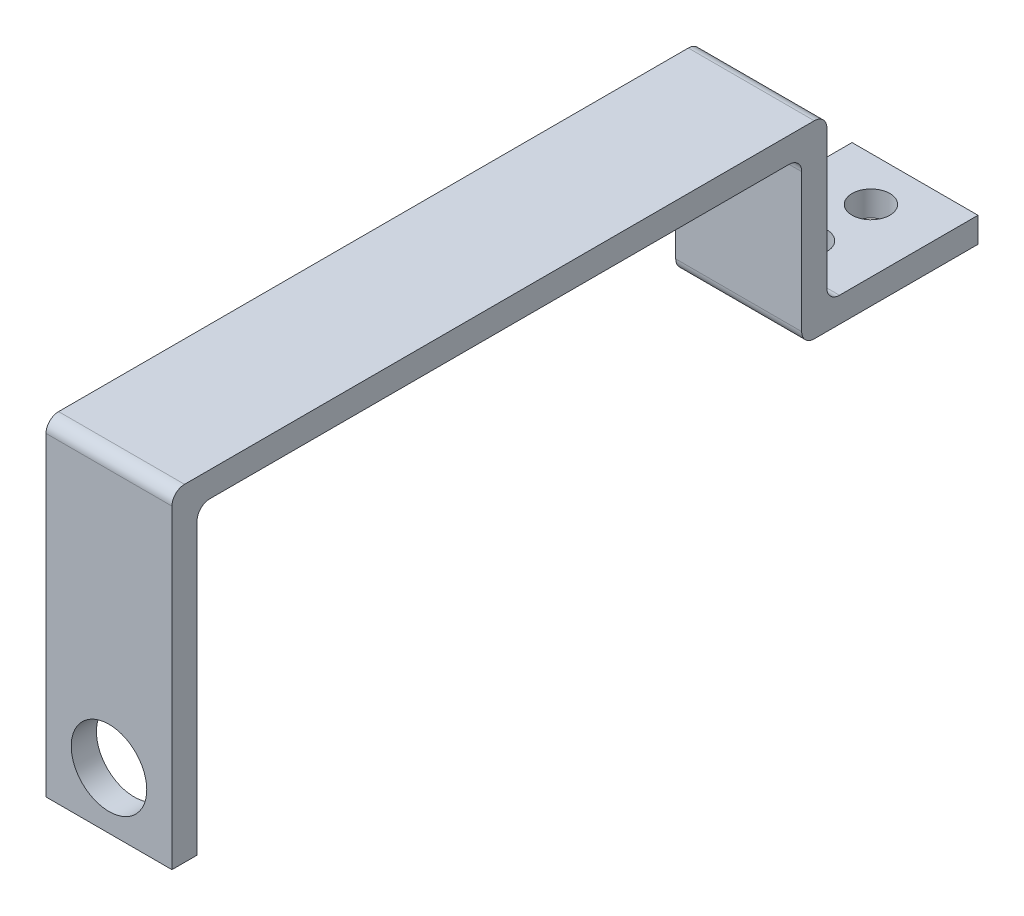
ISO-10303-21;
HEADER;
FILE_DESCRIPTION(('STEP AP214'),'2;1');
FILE_NAME('part.step','',(''),(''),'','','');
FILE_SCHEMA(('AUTOMOTIVE_DESIGN { 1 0 10303 214 1 1 1 1 }'));
ENDSEC;
DATA;
#1=APPLICATION_CONTEXT('core data for automotive mechanical design processes');
#2=APPLICATION_PROTOCOL_DEFINITION('international standard','automotive_design',2000,#1);
#3=PRODUCT_CONTEXT('',#1,'mechanical');
#4=PRODUCT('Part','Part','',(#3));
#5=PRODUCT_RELATED_PRODUCT_CATEGORY('part','',(#4));
#6=PRODUCT_DEFINITION_FORMATION('','',#4);
#7=PRODUCT_DEFINITION_CONTEXT('part definition',#1,'design');
#8=PRODUCT_DEFINITION('design','',#6,#7);
#9=PRODUCT_DEFINITION_SHAPE('','',#8);
#10=(LENGTH_UNIT() NAMED_UNIT(*) SI_UNIT(.MILLI.,.METRE.));
#11=(NAMED_UNIT(*) PLANE_ANGLE_UNIT() SI_UNIT($,.RADIAN.));
#12=(NAMED_UNIT(*) SI_UNIT($,.STERADIAN.) SOLID_ANGLE_UNIT());
#13=UNCERTAINTY_MEASURE_WITH_UNIT(LENGTH_MEASURE(1.E-05),#10,'distance_accuracy_value','');
#14=(GEOMETRIC_REPRESENTATION_CONTEXT(3) GLOBAL_UNCERTAINTY_ASSIGNED_CONTEXT((#13)) GLOBAL_UNIT_ASSIGNED_CONTEXT((#10,
#11,#12)) REPRESENTATION_CONTEXT('',''));
#15=CARTESIAN_POINT('',(0.,0.,0.));
#16=DIRECTION('',(0.,0.,1.));
#17=DIRECTION('',(1.,0.,0.));
#18=AXIS2_PLACEMENT_3D('',#15,#16,#17);
#19=CARTESIAN_POINT('',(0.,2.,0.));
#20=DIRECTION('',(0.,1.,0.));
#21=DIRECTION('',(0.,0.,1.));
#22=AXIS2_PLACEMENT_3D('',#19,#20,#21);
#23=PLANE('',#22);
#24=CARTESIAN_POINT('',(-0.0869565217391276,2.,1.45652173913043));
#25=DIRECTION('',(0.,1.,0.));
#26=DIRECTION('',(0.,0.,1.));
#27=AXIS2_PLACEMENT_3D('',#24,#25,#26);
#28=CIRCLE('',#27,1.5);
#29=CARTESIAN_POINT('',(-0.0869565217391276,2.,2.95652173913043));
#30=VERTEX_POINT('',#29);
#31=EDGE_CURVE('E290',#30,#30,#28,.T.);
#32=ORIENTED_EDGE('',*,*,#31,.F.);
#33=EDGE_LOOP('',(#32));
#34=FACE_BOUND('',#33,.T.);
#35=DIRECTION('',(0.,0.,1.));
#36=VECTOR('',#35,1.);
#37=CARTESIAN_POINT('',(-5.08695652173913,2.,-7.04347826086957));
#38=LINE('',#37,#36);
#39=CARTESIAN_POINT('',(-5.08695652173913,2.,-7.04347826086957));
#40=VERTEX_POINT('',#39);
#41=CARTESIAN_POINT('',(-5.08695652173913,2.,3.95652173913043));
#42=VERTEX_POINT('',#41);
#43=EDGE_CURVE('E261',#40,#42,#38,.T.);
#44=ORIENTED_EDGE('',*,*,#43,.T.);
#45=DIRECTION('',(1.,0.,0.));
#46=VECTOR('',#45,1.);
#47=CARTESIAN_POINT('',(4.91304347826087,2.,3.95652173913043));
#48=LINE('',#47,#46);
#49=CARTESIAN_POINT('',(4.91304347826087,2.,3.95652173913043));
#50=VERTEX_POINT('',#49);
#51=EDGE_CURVE('E256',#42,#50,#48,.T.);
#52=ORIENTED_EDGE('',*,*,#51,.T.);
#53=DIRECTION('',(0.,0.,-1.));
#54=VECTOR('',#53,1.);
#55=CARTESIAN_POINT('',(4.91304347826087,2.,-7.04347826086957));
#56=LINE('',#55,#54);
#57=CARTESIAN_POINT('',(4.91304347826087,2.,-7.04347826086957));
#58=VERTEX_POINT('',#57);
#59=EDGE_CURVE('E257',#50,#58,#56,.T.);
#60=ORIENTED_EDGE('',*,*,#59,.T.);
#61=DIRECTION('',(-1.,0.,0.));
#62=VECTOR('',#61,1.);
#63=CARTESIAN_POINT('',(-5.08695652173913,2.,-7.04347826086957));
#64=LINE('',#63,#62);
#65=EDGE_CURVE('E260',#58,#40,#64,.T.);
#66=ORIENTED_EDGE('',*,*,#65,.T.);
#67=EDGE_LOOP('',(#44,#52,#60,#66));
#68=FACE_BOUND('',#67,.T.);
#69=CARTESIAN_POINT('',(-0.0869565217391276,2.,-3.54347826086957));
#70=DIRECTION('',(0.,1.,0.));
#71=DIRECTION('',(0.,0.,1.));
#72=AXIS2_PLACEMENT_3D('',#69,#70,#71);
#73=CIRCLE('',#72,1.5);
#74=CARTESIAN_POINT('',(-0.0869565217391276,2.,-2.04347826086957));
#75=VERTEX_POINT('',#74);
#76=EDGE_CURVE('E296',#75,#75,#73,.T.);
#77=ORIENTED_EDGE('',*,*,#76,.F.);
#78=EDGE_LOOP('',(#77));
#79=FACE_BOUND('',#78,.T.);
#80=ADVANCED_FACE('F33',(#34,#68,#79),#23,.T.);
#81=CARTESIAN_POINT('',(0.,0.,0.));
#82=DIRECTION('',(0.,1.,0.));
#83=DIRECTION('',(0.,0.,1.));
#84=AXIS2_PLACEMENT_3D('',#81,#82,#83);
#85=PLANE('',#84);
#86=CARTESIAN_POINT('',(-0.0869565217391276,0.,1.45652173913043));
#87=DIRECTION('',(0.,1.,0.));
#88=DIRECTION('',(0.,0.,1.));
#89=AXIS2_PLACEMENT_3D('',#86,#87,#88);
#90=CIRCLE('',#89,1.5);
#91=CARTESIAN_POINT('',(-0.0869565217391276,0.,2.95652173913043));
#92=VERTEX_POINT('',#91);
#93=EDGE_CURVE('E288',#92,#92,#90,.T.);
#94=ORIENTED_EDGE('',*,*,#93,.T.);
#95=EDGE_LOOP('',(#94));
#96=FACE_BOUND('',#95,.T.);
#97=DIRECTION('',(0.,0.,-1.));
#98=VECTOR('',#97,1.);
#99=CARTESIAN_POINT('',(4.91304347826087,0.,-7.04347826086957));
#100=LINE('',#99,#98);
#101=CARTESIAN_POINT('',(4.91304347826087,0.,5.95652173913043));
#102=VERTEX_POINT('',#101);
#103=CARTESIAN_POINT('',(4.91304347826087,0.,-7.04347826086957));
#104=VERTEX_POINT('',#103);
#105=EDGE_CURVE('E273',#102,#104,#100,.T.);
#106=ORIENTED_EDGE('',*,*,#105,.F.);
#107=DIRECTION('',(1.,0.,0.));
#108=VECTOR('',#107,1.);
#109=CARTESIAN_POINT('',(0.,0.,5.95652173913043));
#110=LINE('',#109,#108);
#111=CARTESIAN_POINT('',(-5.08695652173913,0.,5.95652173913043));
#112=VERTEX_POINT('',#111);
#113=EDGE_CURVE('E252',#102,#112,#110,.F.);
#114=ORIENTED_EDGE('',*,*,#113,.T.);
#115=DIRECTION('',(0.,0.,1.));
#116=VECTOR('',#115,1.);
#117=CARTESIAN_POINT('',(-5.08695652173913,0.,-7.04347826086957));
#118=LINE('',#117,#116);
#119=CARTESIAN_POINT('',(-5.08695652173913,0.,-7.04347826086957));
#120=VERTEX_POINT('',#119);
#121=EDGE_CURVE('E280',#120,#112,#118,.T.);
#122=ORIENTED_EDGE('',*,*,#121,.F.);
#123=DIRECTION('',(-1.,0.,0.));
#124=VECTOR('',#123,1.);
#125=CARTESIAN_POINT('',(-5.08695652173913,0.,-7.04347826086957));
#126=LINE('',#125,#124);
#127=EDGE_CURVE('E268',#104,#120,#126,.T.);
#128=ORIENTED_EDGE('',*,*,#127,.F.);
#129=EDGE_LOOP('',(#106,#114,#122,#128));
#130=FACE_BOUND('',#129,.T.);
#131=CARTESIAN_POINT('',(-0.0869565217391276,0.,-3.54347826086957));
#132=DIRECTION('',(0.,1.,0.));
#133=DIRECTION('',(0.,0.,1.));
#134=AXIS2_PLACEMENT_3D('',#131,#132,#133);
#135=CIRCLE('',#134,1.5);
#136=CARTESIAN_POINT('',(-0.0869565217391276,0.,-2.04347826086957));
#137=VERTEX_POINT('',#136);
#138=EDGE_CURVE('E244',#137,#137,#135,.T.);
#139=ORIENTED_EDGE('',*,*,#138,.T.);
#140=EDGE_LOOP('',(#139));
#141=FACE_BOUND('',#140,.T.);
#142=ADVANCED_FACE('F306',(#96,#130,#141),#85,.F.);
#143=CARTESIAN_POINT('',(-5.08695652173913,2.,-7.04347826086957));
#144=DIRECTION('',(1.,0.,0.));
#145=DIRECTION('',(0.,0.,-1.));
#146=AXIS2_PLACEMENT_3D('',#143,#144,#145);
#147=PLANE('',#146);
#148=ORIENTED_EDGE('',*,*,#121,.T.);
#149=CARTESIAN_POINT('',(-5.08695652173913,1.,5.95652173913043));
#150=DIRECTION('',(1.,0.,0.));
#151=DIRECTION('',(0.,0.,-1.));
#152=AXIS2_PLACEMENT_3D('',#149,#150,#151);
#153=CIRCLE('',#152,1.);
#154=CARTESIAN_POINT('',(-5.08695652173913,1.,6.95652173913043));
#155=VERTEX_POINT('',#154);
#156=EDGE_CURVE('E254',#112,#155,#153,.F.);
#157=ORIENTED_EDGE('',*,*,#156,.T.);
#158=DIRECTION('',(0.,-1.,0.));
#159=VECTOR('',#158,1.);
#160=CARTESIAN_POINT('',(-5.08695652173913,0.,6.95652173913043));
#161=LINE('',#160,#159);
#162=CARTESIAN_POINT('',(-5.08695652173913,12.,6.95652173913043));
#163=VERTEX_POINT('',#162);
#164=EDGE_CURVE('E228',#163,#155,#161,.T.);
#165=ORIENTED_EDGE('',*,*,#164,.F.);
#166=CARTESIAN_POINT('',(-5.08695652173913,12.,7.95652173913043));
#167=DIRECTION('',(1.,0.,0.));
#168=DIRECTION('',(0.,0.,-1.));
#169=AXIS2_PLACEMENT_3D('',#166,#167,#168);
#170=CIRCLE('',#169,1.);
#171=CARTESIAN_POINT('',(-5.08695652173913,13.,7.95652173913043));
#172=VERTEX_POINT('',#171);
#173=EDGE_CURVE('E360',#163,#172,#170,.T.);
#174=ORIENTED_EDGE('',*,*,#173,.T.);
#175=DIRECTION('',(0.,0.,1.));
#176=VECTOR('',#175,1.);
#177=CARTESIAN_POINT('',(-5.08695652173913,13.,4.95652173913043));
#178=LINE('',#177,#176);
#179=CARTESIAN_POINT('',(-5.08695652173912,13.,53.9565217391304));
#180=VERTEX_POINT('',#179);
#181=EDGE_CURVE('E173',#172,#180,#178,.T.);
#182=ORIENTED_EDGE('',*,*,#181,.T.);
#183=CARTESIAN_POINT('',(-5.08695652173912,12.,53.9565217391304));
#184=DIRECTION('',(1.,0.,0.));
#185=DIRECTION('',(0.,0.,-1.));
#186=AXIS2_PLACEMENT_3D('',#183,#184,#185);
#187=CIRCLE('',#186,1.);
#188=CARTESIAN_POINT('',(-5.08695652173912,12.,54.9565217391304));
#189=VERTEX_POINT('',#188);
#190=EDGE_CURVE('E372',#180,#189,#187,.T.);
#191=ORIENTED_EDGE('',*,*,#190,.T.);
#192=DIRECTION('',(0.,-1.,0.));
#193=VECTOR('',#192,1.);
#194=CARTESIAN_POINT('',(-5.08695652173912,15.,54.9565217391304));
#195=LINE('',#194,#193);
#196=CARTESIAN_POINT('',(-5.08695652173912,-11.,54.9565217391304));
#197=VERTEX_POINT('',#196);
#198=EDGE_CURVE('E171',#189,#197,#195,.T.);
#199=ORIENTED_EDGE('',*,*,#198,.T.);
#200=DIRECTION('',(0.,0.,-1.));
#201=VECTOR('',#200,1.);
#202=CARTESIAN_POINT('',(-5.08695652173912,-11.,56.9565217391304));
#203=LINE('',#202,#201);
#204=CARTESIAN_POINT('',(-5.08695652173912,-11.,56.9565217391304));
#205=VERTEX_POINT('',#204);
#206=EDGE_CURVE('E162',#205,#197,#203,.T.);
#207=ORIENTED_EDGE('',*,*,#206,.F.);
#208=DIRECTION('',(0.,-1.,0.));
#209=VECTOR('',#208,1.);
#210=CARTESIAN_POINT('',(-5.08695652173912,15.,56.9565217391304));
#211=LINE('',#210,#209);
#212=CARTESIAN_POINT('',(-5.08695652173912,14.,56.9565217391304));
#213=VERTEX_POINT('',#212);
#214=EDGE_CURVE('E145',#213,#205,#211,.T.);
#215=ORIENTED_EDGE('',*,*,#214,.F.);
#216=CARTESIAN_POINT('',(-5.08695652173912,14.,55.9565217391304));
#217=DIRECTION('',(1.,0.,0.));
#218=DIRECTION('',(0.,0.,-1.));
#219=AXIS2_PLACEMENT_3D('',#216,#217,#218);
#220=CIRCLE('',#219,1.);
#221=CARTESIAN_POINT('',(-5.08695652173912,15.,55.9565217391304));
#222=VERTEX_POINT('',#221);
#223=EDGE_CURVE('E381',#213,#222,#220,.F.);
#224=ORIENTED_EDGE('',*,*,#223,.T.);
#225=DIRECTION('',(0.,0.,1.));
#226=VECTOR('',#225,1.);
#227=CARTESIAN_POINT('',(-5.08695652173913,15.,4.95652173913043));
#228=LINE('',#227,#226);
#229=CARTESIAN_POINT('',(-5.08695652173913,15.,5.95652173913043));
#230=VERTEX_POINT('',#229);
#231=EDGE_CURVE('E183',#230,#222,#228,.T.);
#232=ORIENTED_EDGE('',*,*,#231,.F.);
#233=CARTESIAN_POINT('',(-5.08695652173913,14.,5.95652173913043));
#234=DIRECTION('',(1.,0.,0.));
#235=DIRECTION('',(0.,0.,-1.));
#236=AXIS2_PLACEMENT_3D('',#233,#234,#235);
#237=CIRCLE('',#236,1.);
#238=CARTESIAN_POINT('',(-5.08695652173913,14.,4.95652173913043));
#239=VERTEX_POINT('',#238);
#240=EDGE_CURVE('E220',#230,#239,#237,.F.);
#241=ORIENTED_EDGE('',*,*,#240,.T.);
#242=DIRECTION('',(0.,-1.,0.));
#243=VECTOR('',#242,1.);
#244=CARTESIAN_POINT('',(-5.08695652173913,0.,4.95652173913043));
#245=LINE('',#244,#243);
#246=CARTESIAN_POINT('',(-5.08695652173913,3.,4.95652173913043));
#247=VERTEX_POINT('',#246);
#248=EDGE_CURVE('E213',#239,#247,#245,.T.);
#249=ORIENTED_EDGE('',*,*,#248,.T.);
#250=CARTESIAN_POINT('',(-5.08695652173913,3.,3.95652173913043));
#251=DIRECTION('',(1.,0.,0.));
#252=DIRECTION('',(0.,0.,-1.));
#253=AXIS2_PLACEMENT_3D('',#250,#251,#252);
#254=CIRCLE('',#253,1.);
#255=EDGE_CURVE('E11',#247,#42,#254,.T.);
#256=ORIENTED_EDGE('',*,*,#255,.T.);
#257=ORIENTED_EDGE('',*,*,#43,.F.);
#258=DIRECTION('',(0.,-1.,0.));
#259=VECTOR('',#258,1.);
#260=CARTESIAN_POINT('',(-5.08695652173913,2.,-7.04347826086957));
#261=LINE('',#260,#259);
#262=EDGE_CURVE('E283',#40,#120,#261,.T.);
#263=ORIENTED_EDGE('',*,*,#262,.T.);
#264=EDGE_LOOP('',(#148,#157,#165,#174,#182,#191,#199,#207,#215,#224,#232,#241,#249,#256,#257,#263));
#265=FACE_BOUND('',#264,.T.);
#266=ADVANCED_FACE('F169',(#265),#147,.F.);
#267=CARTESIAN_POINT('',(4.91304347826087,2.,-7.04347826086957));
#268=DIRECTION('',(-1.,0.,0.));
#269=DIRECTION('',(0.,0.,1.));
#270=AXIS2_PLACEMENT_3D('',#267,#268,#269);
#271=PLANE('',#270);
#272=DIRECTION('',(0.,1.,0.));
#273=VECTOR('',#272,1.);
#274=CARTESIAN_POINT('',(4.91304347826087,0.,6.95652173913043));
#275=LINE('',#274,#273);
#276=CARTESIAN_POINT('',(4.91304347826087,1.,6.95652173913043));
#277=VERTEX_POINT('',#276);
#278=CARTESIAN_POINT('',(4.91304347826087,12.,6.95652173913043));
#279=VERTEX_POINT('',#278);
#280=EDGE_CURVE('E232',#277,#279,#275,.T.);
#281=ORIENTED_EDGE('',*,*,#280,.F.);
#282=CARTESIAN_POINT('',(4.91304347826087,1.,5.95652173913043));
#283=DIRECTION('',(-1.,0.,0.));
#284=DIRECTION('',(0.,0.,1.));
#285=AXIS2_PLACEMENT_3D('',#282,#283,#284);
#286=CIRCLE('',#285,1.);
#287=EDGE_CURVE('E250',#277,#102,#286,.F.);
#288=ORIENTED_EDGE('',*,*,#287,.T.);
#289=ORIENTED_EDGE('',*,*,#105,.T.);
#290=DIRECTION('',(0.,-1.,0.));
#291=VECTOR('',#290,1.);
#292=CARTESIAN_POINT('',(4.91304347826087,2.,-7.04347826086957));
#293=LINE('',#292,#291);
#294=EDGE_CURVE('E265',#58,#104,#293,.T.);
#295=ORIENTED_EDGE('',*,*,#294,.F.);
#296=ORIENTED_EDGE('',*,*,#59,.F.);
#297=CARTESIAN_POINT('',(4.91304347826087,3.,3.95652173913043));
#298=DIRECTION('',(-1.,0.,0.));
#299=DIRECTION('',(0.,0.,1.));
#300=AXIS2_PLACEMENT_3D('',#297,#298,#299);
#301=CIRCLE('',#300,1.);
#302=CARTESIAN_POINT('',(4.91304347826087,3.,4.95652173913043));
#303=VERTEX_POINT('',#302);
#304=EDGE_CURVE('E41',#50,#303,#301,.T.);
#305=ORIENTED_EDGE('',*,*,#304,.T.);
#306=DIRECTION('',(0.,1.,0.));
#307=VECTOR('',#306,1.);
#308=CARTESIAN_POINT('',(4.91304347826087,0.,4.95652173913043));
#309=LINE('',#308,#307);
#310=CARTESIAN_POINT('',(4.91304347826087,14.,4.95652173913043));
#311=VERTEX_POINT('',#310);
#312=EDGE_CURVE('E216',#303,#311,#309,.T.);
#313=ORIENTED_EDGE('',*,*,#312,.T.);
#314=CARTESIAN_POINT('',(4.91304347826087,14.,5.95652173913043));
#315=DIRECTION('',(-1.,0.,0.));
#316=DIRECTION('',(0.,0.,1.));
#317=AXIS2_PLACEMENT_3D('',#314,#315,#316);
#318=CIRCLE('',#317,1.);
#319=CARTESIAN_POINT('',(4.91304347826087,15.,5.95652173913043));
#320=VERTEX_POINT('',#319);
#321=EDGE_CURVE('E225',#311,#320,#318,.F.);
#322=ORIENTED_EDGE('',*,*,#321,.T.);
#323=DIRECTION('',(0.,0.,-1.));
#324=VECTOR('',#323,1.);
#325=CARTESIAN_POINT('',(4.91304347826087,15.,4.95652173913043));
#326=LINE('',#325,#324);
#327=CARTESIAN_POINT('',(4.91304347826088,15.,55.9565217391304));
#328=VERTEX_POINT('',#327);
#329=EDGE_CURVE('E217',#328,#320,#326,.T.);
#330=ORIENTED_EDGE('',*,*,#329,.F.);
#331=CARTESIAN_POINT('',(4.91304347826088,14.,55.9565217391304));
#332=DIRECTION('',(-1.,0.,0.));
#333=DIRECTION('',(0.,0.,1.));
#334=AXIS2_PLACEMENT_3D('',#331,#332,#333);
#335=CIRCLE('',#334,1.);
#336=CARTESIAN_POINT('',(4.91304347826088,14.,56.9565217391304));
#337=VERTEX_POINT('',#336);
#338=EDGE_CURVE('E194',#328,#337,#335,.F.);
#339=ORIENTED_EDGE('',*,*,#338,.T.);
#340=DIRECTION('',(0.,1.,0.));
#341=VECTOR('',#340,1.);
#342=CARTESIAN_POINT('',(4.91304347826088,15.,56.9565217391304));
#343=LINE('',#342,#341);
#344=CARTESIAN_POINT('',(4.91304347826088,-11.,56.9565217391304));
#345=VERTEX_POINT('',#344);
#346=EDGE_CURVE('E166',#345,#337,#343,.T.);
#347=ORIENTED_EDGE('',*,*,#346,.F.);
#348=DIRECTION('',(0.,0.,-1.));
#349=VECTOR('',#348,1.);
#350=CARTESIAN_POINT('',(4.91304347826088,-11.,56.9565217391304));
#351=LINE('',#350,#349);
#352=CARTESIAN_POINT('',(4.91304347826088,-11.,54.9565217391304));
#353=VERTEX_POINT('',#352);
#354=EDGE_CURVE('E164',#345,#353,#351,.T.);
#355=ORIENTED_EDGE('',*,*,#354,.T.);
#356=DIRECTION('',(0.,1.,0.));
#357=VECTOR('',#356,1.);
#358=CARTESIAN_POINT('',(4.91304347826088,15.,54.9565217391304));
#359=LINE('',#358,#357);
#360=CARTESIAN_POINT('',(4.91304347826088,12.,54.9565217391304));
#361=VERTEX_POINT('',#360);
#362=EDGE_CURVE('E157',#353,#361,#359,.T.);
#363=ORIENTED_EDGE('',*,*,#362,.T.);
#364=CARTESIAN_POINT('',(4.91304347826088,12.,53.9565217391304));
#365=DIRECTION('',(-1.,0.,0.));
#366=DIRECTION('',(0.,0.,1.));
#367=AXIS2_PLACEMENT_3D('',#364,#365,#366);
#368=CIRCLE('',#367,1.);
#369=CARTESIAN_POINT('',(4.91304347826088,13.,53.9565217391304));
#370=VERTEX_POINT('',#369);
#371=EDGE_CURVE('E366',#361,#370,#368,.T.);
#372=ORIENTED_EDGE('',*,*,#371,.T.);
#373=DIRECTION('',(0.,0.,-1.));
#374=VECTOR('',#373,1.);
#375=CARTESIAN_POINT('',(4.91304347826087,13.,4.95652173913043));
#376=LINE('',#375,#374);
#377=CARTESIAN_POINT('',(4.91304347826087,13.,7.95652173913043));
#378=VERTEX_POINT('',#377);
#379=EDGE_CURVE('E175',#370,#378,#376,.T.);
#380=ORIENTED_EDGE('',*,*,#379,.T.);
#381=CARTESIAN_POINT('',(4.91304347826087,12.,7.95652173913043));
#382=DIRECTION('',(-1.,0.,0.));
#383=DIRECTION('',(0.,0.,1.));
#384=AXIS2_PLACEMENT_3D('',#381,#382,#383);
#385=CIRCLE('',#384,1.);
#386=EDGE_CURVE('E245',#378,#279,#385,.T.);
#387=ORIENTED_EDGE('',*,*,#386,.T.);
#388=EDGE_LOOP('',(#281,#288,#289,#295,#296,#305,#313,#322,#330,#339,#347,#355,#363,#372,#380,#387));
#389=FACE_BOUND('',#388,.T.);
#390=ADVANCED_FACE('F321',(#389),#271,.F.);
#391=CARTESIAN_POINT('',(-5.08695652173913,2.,-7.04347826086957));
#392=DIRECTION('',(0.,0.,1.));
#393=DIRECTION('',(1.,0.,0.));
#394=AXIS2_PLACEMENT_3D('',#391,#392,#393);
#395=PLANE('',#394);
#396=ORIENTED_EDGE('',*,*,#127,.T.);
#397=ORIENTED_EDGE('',*,*,#262,.F.);
#398=ORIENTED_EDGE('',*,*,#65,.F.);
#399=ORIENTED_EDGE('',*,*,#294,.T.);
#400=EDGE_LOOP('',(#396,#397,#398,#399));
#401=FACE_BOUND('',#400,.T.);
#402=ADVANCED_FACE('F318',(#401),#395,.F.);
#403=CARTESIAN_POINT('',(-0.0869565217391276,2.,1.45652173913043));
#404=DIRECTION('',(0.,-1.,0.));
#405=DIRECTION('',(0.,0.,-1.));
#406=AXIS2_PLACEMENT_3D('',#403,#404,#405);
#407=CYLINDRICAL_SURFACE('',#406,1.5);
#408=ORIENTED_EDGE('',*,*,#31,.T.);
#409=EDGE_LOOP('',(#408));
#410=FACE_BOUND('',#409,.T.);
#411=ORIENTED_EDGE('',*,*,#93,.F.);
#412=EDGE_LOOP('',(#411));
#413=FACE_BOUND('',#412,.T.);
#414=ADVANCED_FACE('F315',(#410,#413),#407,.F.);
#415=CARTESIAN_POINT('',(-0.0869565217391276,2.,-3.54347826086957));
#416=DIRECTION('',(0.,-1.,0.));
#417=DIRECTION('',(0.,0.,-1.));
#418=AXIS2_PLACEMENT_3D('',#415,#416,#417);
#419=CYLINDRICAL_SURFACE('',#418,1.5);
#420=ORIENTED_EDGE('',*,*,#76,.T.);
#421=EDGE_LOOP('',(#420));
#422=FACE_BOUND('',#421,.T.);
#423=ORIENTED_EDGE('',*,*,#138,.F.);
#424=EDGE_LOOP('',(#423));
#425=FACE_BOUND('',#424,.T.);
#426=ADVANCED_FACE('F302',(#422,#425),#419,.F.);
#427=CARTESIAN_POINT('',(0.,0.,4.95652173913043));
#428=DIRECTION('',(0.,0.,-1.));
#429=DIRECTION('',(-1.,0.,0.));
#430=AXIS2_PLACEMENT_3D('',#427,#428,#429);
#431=PLANE('',#430);
#432=ORIENTED_EDGE('',*,*,#312,.F.);
#433=DIRECTION('',(1.,0.,0.));
#434=VECTOR('',#433,1.);
#435=CARTESIAN_POINT('',(-5.08695652173913,3.,4.95652173913043));
#436=LINE('',#435,#434);
#437=EDGE_CURVE('E54',#303,#247,#436,.F.);
#438=ORIENTED_EDGE('',*,*,#437,.T.);
#439=ORIENTED_EDGE('',*,*,#248,.F.);
#440=DIRECTION('',(-1.,0.,0.));
#441=VECTOR('',#440,1.);
#442=CARTESIAN_POINT('',(0.,14.,4.95652173913043));
#443=LINE('',#442,#441);
#444=EDGE_CURVE('E222',#239,#311,#443,.F.);
#445=ORIENTED_EDGE('',*,*,#444,.T.);
#446=EDGE_LOOP('',(#432,#438,#439,#445));
#447=FACE_BOUND('',#446,.T.);
#448=ADVANCED_FACE('F386',(#447),#431,.T.);
#449=CARTESIAN_POINT('',(0.,0.,6.95652173913043));
#450=DIRECTION('',(0.,0.,-1.));
#451=DIRECTION('',(-1.,0.,0.));
#452=AXIS2_PLACEMENT_3D('',#449,#450,#451);
#453=PLANE('',#452);
#454=ORIENTED_EDGE('',*,*,#164,.T.);
#455=DIRECTION('',(1.,0.,0.));
#456=VECTOR('',#455,1.);
#457=CARTESIAN_POINT('',(0.,1.,6.95652173913043));
#458=LINE('',#457,#456);
#459=EDGE_CURVE('E247',#155,#277,#458,.T.);
#460=ORIENTED_EDGE('',*,*,#459,.T.);
#461=ORIENTED_EDGE('',*,*,#280,.T.);
#462=DIRECTION('',(-1.,0.,0.));
#463=VECTOR('',#462,1.);
#464=CARTESIAN_POINT('',(-5.08695652173913,12.,6.95652173913043));
#465=LINE('',#464,#463);
#466=EDGE_CURVE('E227',#279,#163,#465,.T.);
#467=ORIENTED_EDGE('',*,*,#466,.T.);
#468=EDGE_LOOP('',(#454,#460,#461,#467));
#469=FACE_BOUND('',#468,.T.);
#470=ADVANCED_FACE('F354',(#469),#453,.F.);
#471=CARTESIAN_POINT('',(0.,15.,0.));
#472=DIRECTION('',(0.,1.,0.));
#473=DIRECTION('',(0.,0.,1.));
#474=AXIS2_PLACEMENT_3D('',#471,#472,#473);
#475=PLANE('',#474);
#476=ORIENTED_EDGE('',*,*,#329,.T.);
#477=DIRECTION('',(-1.,0.,0.));
#478=VECTOR('',#477,1.);
#479=CARTESIAN_POINT('',(0.,15.,5.95652173913043));
#480=LINE('',#479,#478);
#481=EDGE_CURVE('E218',#320,#230,#480,.T.);
#482=ORIENTED_EDGE('',*,*,#481,.T.);
#483=ORIENTED_EDGE('',*,*,#231,.T.);
#484=DIRECTION('',(-1.,0.,0.));
#485=VECTOR('',#484,1.);
#486=CARTESIAN_POINT('',(0.,15.,55.9565217391304));
#487=LINE('',#486,#485);
#488=EDGE_CURVE('E383',#222,#328,#487,.F.);
#489=ORIENTED_EDGE('',*,*,#488,.T.);
#490=EDGE_LOOP('',(#476,#482,#483,#489));
#491=FACE_BOUND('',#490,.T.);
#492=ADVANCED_FACE('F378',(#491),#475,.T.);
#493=CARTESIAN_POINT('',(0.,13.,0.));
#494=DIRECTION('',(0.,1.,0.));
#495=DIRECTION('',(0.,0.,1.));
#496=AXIS2_PLACEMENT_3D('',#493,#494,#495);
#497=PLANE('',#496);
#498=ORIENTED_EDGE('',*,*,#181,.F.);
#499=DIRECTION('',(-1.,0.,0.));
#500=VECTOR('',#499,1.);
#501=CARTESIAN_POINT('',(4.91304347826087,13.,7.95652173913043));
#502=LINE('',#501,#500);
#503=EDGE_CURVE('E359',#172,#378,#502,.F.);
#504=ORIENTED_EDGE('',*,*,#503,.T.);
#505=ORIENTED_EDGE('',*,*,#379,.F.);
#506=DIRECTION('',(1.,0.,0.));
#507=VECTOR('',#506,1.);
#508=CARTESIAN_POINT('',(-5.08695652173912,13.,53.9565217391304));
#509=LINE('',#508,#507);
#510=EDGE_CURVE('E199',#370,#180,#509,.F.);
#511=ORIENTED_EDGE('',*,*,#510,.T.);
#512=EDGE_LOOP('',(#498,#504,#505,#511));
#513=FACE_BOUND('',#512,.T.);
#514=ADVANCED_FACE('F369',(#513),#497,.F.);
#515=CARTESIAN_POINT('',(0.,0.,54.9565217391304));
#516=DIRECTION('',(0.,0.,1.));
#517=DIRECTION('',(1.,0.,0.));
#518=AXIS2_PLACEMENT_3D('',#515,#516,#517);
#519=PLANE('',#518);
#520=CARTESIAN_POINT('',(-0.0869565217391215,-6.5,54.9565217391304));
#521=DIRECTION('',(0.,0.,1.));
#522=DIRECTION('',(1.,0.,0.));
#523=AXIS2_PLACEMENT_3D('',#520,#521,#522);
#524=CIRCLE('',#523,3.);
#525=CARTESIAN_POINT('',(2.91304347826088,-6.5,54.9565217391304));
#526=VERTEX_POINT('',#525);
#527=EDGE_CURVE('E424',#526,#526,#524,.T.);
#528=ORIENTED_EDGE('',*,*,#527,.T.);
#529=EDGE_LOOP('',(#528));
#530=FACE_BOUND('',#529,.T.);
#531=ORIENTED_EDGE('',*,*,#198,.F.);
#532=DIRECTION('',(1.,0.,0.));
#533=VECTOR('',#532,1.);
#534=CARTESIAN_POINT('',(4.91304347826088,12.,54.9565217391304));
#535=LINE('',#534,#533);
#536=EDGE_CURVE('E196',#189,#361,#535,.T.);
#537=ORIENTED_EDGE('',*,*,#536,.T.);
#538=ORIENTED_EDGE('',*,*,#362,.F.);
#539=DIRECTION('',(1.,0.,0.));
#540=VECTOR('',#539,1.);
#541=CARTESIAN_POINT('',(-5.08695652173912,-11.,54.9565217391304));
#542=LINE('',#541,#540);
#543=EDGE_CURVE('E182',#197,#353,#542,.T.);
#544=ORIENTED_EDGE('',*,*,#543,.F.);
#545=EDGE_LOOP('',(#531,#537,#538,#544));
#546=FACE_BOUND('',#545,.T.);
#547=ADVANCED_FACE('F405',(#530,#546),#519,.F.);
#548=CARTESIAN_POINT('',(0.,0.,56.9565217391304));
#549=DIRECTION('',(0.,0.,1.));
#550=DIRECTION('',(1.,0.,0.));
#551=AXIS2_PLACEMENT_3D('',#548,#549,#550);
#552=PLANE('',#551);
#553=ORIENTED_EDGE('',*,*,#346,.T.);
#554=DIRECTION('',(-1.,0.,0.));
#555=VECTOR('',#554,1.);
#556=CARTESIAN_POINT('',(0.,14.,56.9565217391304));
#557=LINE('',#556,#555);
#558=EDGE_CURVE('E153',#337,#213,#557,.T.);
#559=ORIENTED_EDGE('',*,*,#558,.T.);
#560=ORIENTED_EDGE('',*,*,#214,.T.);
#561=DIRECTION('',(1.,0.,0.));
#562=VECTOR('',#561,1.);
#563=CARTESIAN_POINT('',(-5.08695652173912,-11.,56.9565217391304));
#564=LINE('',#563,#562);
#565=EDGE_CURVE('E150',#205,#345,#564,.T.);
#566=ORIENTED_EDGE('',*,*,#565,.T.);
#567=EDGE_LOOP('',(#553,#559,#560,#566));
#568=FACE_BOUND('',#567,.T.);
#569=CARTESIAN_POINT('',(-0.0869565217391215,-6.5,56.9565217391304));
#570=DIRECTION('',(0.,0.,1.));
#571=DIRECTION('',(1.,0.,0.));
#572=AXIS2_PLACEMENT_3D('',#569,#570,#571);
#573=CIRCLE('',#572,3.);
#574=CARTESIAN_POINT('',(2.91304347826088,-6.5,56.9565217391304));
#575=VERTEX_POINT('',#574);
#576=EDGE_CURVE('E193',#575,#575,#573,.T.);
#577=ORIENTED_EDGE('',*,*,#576,.F.);
#578=EDGE_LOOP('',(#577));
#579=FACE_BOUND('',#578,.T.);
#580=ADVANCED_FACE('F148',(#568,#579),#552,.T.);
#581=CARTESIAN_POINT('',(-5.08695652173912,-11.,56.9565217391304));
#582=DIRECTION('',(0.,1.,0.));
#583=DIRECTION('',(0.,0.,1.));
#584=AXIS2_PLACEMENT_3D('',#581,#582,#583);
#585=PLANE('',#584);
#586=ORIENTED_EDGE('',*,*,#543,.T.);
#587=ORIENTED_EDGE('',*,*,#354,.F.);
#588=ORIENTED_EDGE('',*,*,#565,.F.);
#589=ORIENTED_EDGE('',*,*,#206,.T.);
#590=EDGE_LOOP('',(#586,#587,#588,#589));
#591=FACE_BOUND('',#590,.T.);
#592=ADVANCED_FACE('F161',(#591),#585,.F.);
#593=CARTESIAN_POINT('',(-0.0869565217391215,-6.5,56.9565217391304));
#594=DIRECTION('',(0.,0.,-1.));
#595=DIRECTION('',(-1.,0.,0.));
#596=AXIS2_PLACEMENT_3D('',#593,#594,#595);
#597=CYLINDRICAL_SURFACE('',#596,3.);
#598=ORIENTED_EDGE('',*,*,#576,.T.);
#599=EDGE_LOOP('',(#598));
#600=FACE_BOUND('',#599,.T.);
#601=ORIENTED_EDGE('',*,*,#527,.F.);
#602=EDGE_LOOP('',(#601));
#603=FACE_BOUND('',#602,.T.);
#604=ADVANCED_FACE('F330',(#600,#603),#597,.F.);
#605=CARTESIAN_POINT('',(0.,14.,55.9565217391304));
#606=DIRECTION('',(-1.,0.,0.));
#607=DIRECTION('',(0.,0.,1.));
#608=AXIS2_PLACEMENT_3D('',#605,#606,#607);
#609=CYLINDRICAL_SURFACE('',#608,1.);
#610=ORIENTED_EDGE('',*,*,#338,.F.);
#611=ORIENTED_EDGE('',*,*,#488,.F.);
#612=ORIENTED_EDGE('',*,*,#223,.F.);
#613=ORIENTED_EDGE('',*,*,#558,.F.);
#614=EDGE_LOOP('',(#610,#611,#612,#613));
#615=FACE_BOUND('',#614,.T.);
#616=ADVANCED_FACE('F326',(#615),#609,.T.);
#617=CARTESIAN_POINT('',(0.,12.,53.9565217391304));
#618=DIRECTION('',(-1.,0.,0.));
#619=DIRECTION('',(0.,0.,1.));
#620=AXIS2_PLACEMENT_3D('',#617,#618,#619);
#621=CYLINDRICAL_SURFACE('',#620,1.);
#622=ORIENTED_EDGE('',*,*,#190,.F.);
#623=ORIENTED_EDGE('',*,*,#510,.F.);
#624=ORIENTED_EDGE('',*,*,#371,.F.);
#625=ORIENTED_EDGE('',*,*,#536,.F.);
#626=EDGE_LOOP('',(#622,#623,#624,#625));
#627=FACE_BOUND('',#626,.T.);
#628=ADVANCED_FACE('F329',(#627),#621,.F.);
#629=CARTESIAN_POINT('',(0.,14.,5.95652173913043));
#630=DIRECTION('',(-1.,0.,0.));
#631=DIRECTION('',(0.,0.,1.));
#632=AXIS2_PLACEMENT_3D('',#629,#630,#631);
#633=CYLINDRICAL_SURFACE('',#632,1.);
#634=ORIENTED_EDGE('',*,*,#321,.F.);
#635=ORIENTED_EDGE('',*,*,#444,.F.);
#636=ORIENTED_EDGE('',*,*,#240,.F.);
#637=ORIENTED_EDGE('',*,*,#481,.F.);
#638=EDGE_LOOP('',(#634,#635,#636,#637));
#639=FACE_BOUND('',#638,.T.);
#640=ADVANCED_FACE('F334',(#639),#633,.T.);
#641=CARTESIAN_POINT('',(0.,12.,7.95652173913043));
#642=DIRECTION('',(1.,0.,0.));
#643=DIRECTION('',(0.,0.,-1.));
#644=AXIS2_PLACEMENT_3D('',#641,#642,#643);
#645=CYLINDRICAL_SURFACE('',#644,1.);
#646=ORIENTED_EDGE('',*,*,#386,.F.);
#647=ORIENTED_EDGE('',*,*,#503,.F.);
#648=ORIENTED_EDGE('',*,*,#173,.F.);
#649=ORIENTED_EDGE('',*,*,#466,.F.);
#650=EDGE_LOOP('',(#646,#647,#648,#649));
#651=FACE_BOUND('',#650,.T.);
#652=ADVANCED_FACE('F338',(#651),#645,.F.);
#653=CARTESIAN_POINT('',(0.,1.,5.95652173913043));
#654=DIRECTION('',(1.,0.,0.));
#655=DIRECTION('',(0.,0.,-1.));
#656=AXIS2_PLACEMENT_3D('',#653,#654,#655);
#657=CYLINDRICAL_SURFACE('',#656,1.);
#658=ORIENTED_EDGE('',*,*,#156,.F.);
#659=ORIENTED_EDGE('',*,*,#113,.F.);
#660=ORIENTED_EDGE('',*,*,#287,.F.);
#661=ORIENTED_EDGE('',*,*,#459,.F.);
#662=EDGE_LOOP('',(#658,#659,#660,#661));
#663=FACE_BOUND('',#662,.T.);
#664=ADVANCED_FACE('F341',(#663),#657,.T.);
#665=CARTESIAN_POINT('',(0.,3.,3.95652173913043));
#666=DIRECTION('',(-1.,0.,0.));
#667=DIRECTION('',(0.,0.,1.));
#668=AXIS2_PLACEMENT_3D('',#665,#666,#667);
#669=CYLINDRICAL_SURFACE('',#668,1.);
#670=ORIENTED_EDGE('',*,*,#255,.F.);
#671=ORIENTED_EDGE('',*,*,#437,.F.);
#672=ORIENTED_EDGE('',*,*,#304,.F.);
#673=ORIENTED_EDGE('',*,*,#51,.F.);
#674=EDGE_LOOP('',(#670,#671,#672,#673));
#675=FACE_BOUND('',#674,.T.);
#676=ADVANCED_FACE('F35',(#675),#669,.F.);
#677=CLOSED_SHELL('',(#80,#142,#266,#390,#402,#414,#426,#448,#470,#492,#514,#547,#580,#592,#604,
#616,#628,#640,#652,#664,#676));
#678=MANIFOLD_SOLID_BREP('B2',#677);
#679=ADVANCED_BREP_SHAPE_REPRESENTATION('',(#18,#678),#14);
#680=SHAPE_DEFINITION_REPRESENTATION(#9,#679);
ENDSEC;
END-ISO-10303-21;
